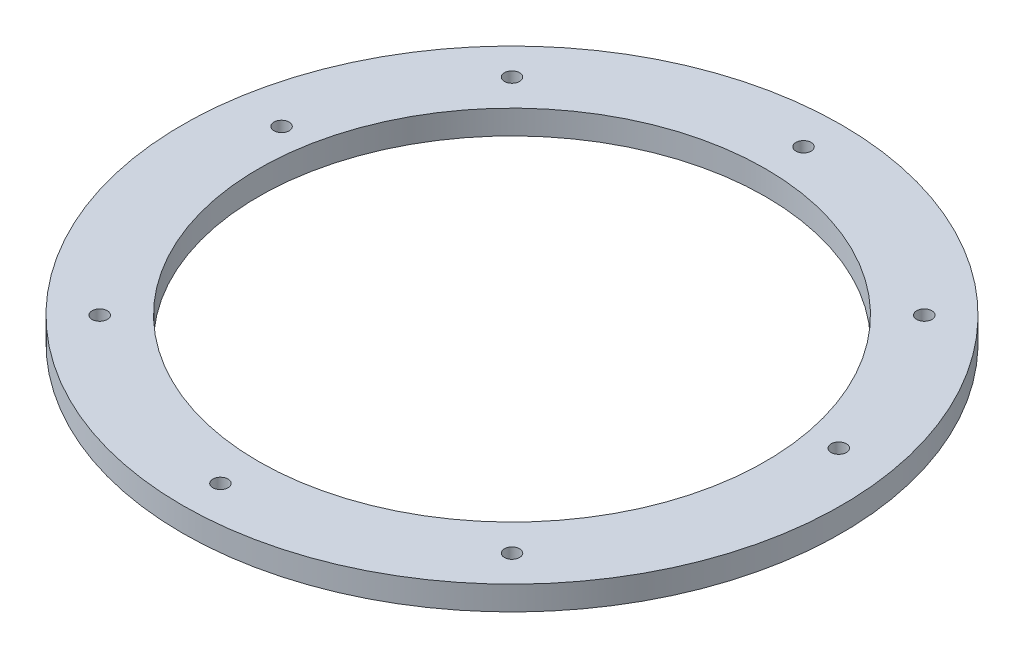
ISO-10303-21;
HEADER;
FILE_DESCRIPTION(('STEP AP214'),'2;1');
FILE_NAME('part.step','',(''),(''),'','','');
FILE_SCHEMA(('AUTOMOTIVE_DESIGN { 1 0 10303 214 1 1 1 1 }'));
ENDSEC;
DATA;
#1=APPLICATION_CONTEXT('core data for automotive mechanical design processes');
#2=APPLICATION_PROTOCOL_DEFINITION('international standard','automotive_design',2000,#1);
#3=PRODUCT_CONTEXT('',#1,'mechanical');
#4=PRODUCT('Part','Part','',(#3));
#5=PRODUCT_RELATED_PRODUCT_CATEGORY('part','',(#4));
#6=PRODUCT_DEFINITION_FORMATION('','',#4);
#7=PRODUCT_DEFINITION_CONTEXT('part definition',#1,'design');
#8=PRODUCT_DEFINITION('design','',#6,#7);
#9=PRODUCT_DEFINITION_SHAPE('','',#8);
#10=(LENGTH_UNIT() NAMED_UNIT(*) SI_UNIT(.MILLI.,.METRE.));
#11=(NAMED_UNIT(*) PLANE_ANGLE_UNIT() SI_UNIT($,.RADIAN.));
#12=(NAMED_UNIT(*) SI_UNIT($,.STERADIAN.) SOLID_ANGLE_UNIT());
#13=UNCERTAINTY_MEASURE_WITH_UNIT(LENGTH_MEASURE(1.E-05),#10,'distance_accuracy_value','');
#14=(GEOMETRIC_REPRESENTATION_CONTEXT(3) GLOBAL_UNCERTAINTY_ASSIGNED_CONTEXT((#13)) GLOBAL_UNIT_ASSIGNED_CONTEXT((#10,
#11,#12)) REPRESENTATION_CONTEXT('',''));
#15=CARTESIAN_POINT('',(0.,0.,0.));
#16=DIRECTION('',(0.,0.,1.));
#17=DIRECTION('',(1.,0.,0.));
#18=AXIS2_PLACEMENT_3D('',#15,#16,#17);
#19=CARTESIAN_POINT('',(0.,4.75,0.));
#20=DIRECTION('',(0.,1.,0.));
#21=DIRECTION('',(0.,0.,1.));
#22=AXIS2_PLACEMENT_3D('',#19,#20,#21);
#23=PLANE('',#22);
#24=CARTESIAN_POINT('',(54.9519052838329,4.75,-9.49999999999948));
#25=DIRECTION('',(0.,1.,0.));
#26=DIRECTION('',(0.,0.,1.));
#27=AXIS2_PLACEMENT_3D('',#24,#25,#26);
#28=CIRCLE('',#27,1.5);
#29=CARTESIAN_POINT('',(54.9519052838329,4.75,-7.99999999999948));
#30=VERTEX_POINT('',#29);
#31=EDGE_CURVE('E108',#30,#30,#28,.T.);
#32=ORIENTED_EDGE('',*,*,#31,.F.);
#33=EDGE_LOOP('',(#32));
#34=FACE_BOUND('',#33,.T.);
#35=CARTESIAN_POINT('',(-54.9519052838329,4.75,-9.49999999999948));
#36=DIRECTION('',(0.,1.,0.));
#37=DIRECTION('',(0.,0.,-1.));
#38=AXIS2_PLACEMENT_3D('',#35,#36,#37);
#39=CIRCLE('',#38,1.5);
#40=CARTESIAN_POINT('',(-54.9519052838329,4.75,-10.9999999999995));
#41=VERTEX_POINT('',#40);
#42=EDGE_CURVE('E105',#41,#41,#39,.T.);
#43=ORIENTED_EDGE('',*,*,#42,.F.);
#44=EDGE_LOOP('',(#43));
#45=FACE_BOUND('',#44,.T.);
#46=CARTESIAN_POINT('',(0.,4.75,-57.5));
#47=DIRECTION('',(0.,-1.,0.));
#48=DIRECTION('',(0.,0.,-1.));
#49=AXIS2_PLACEMENT_3D('',#46,#47,#48);
#50=CIRCLE('',#49,1.5);
#51=CARTESIAN_POINT('',(0.,4.75,-59.));
#52=VERTEX_POINT('',#51);
#53=EDGE_CURVE('E90',#52,#52,#50,.T.);
#54=ORIENTED_EDGE('',*,*,#53,.T.);
#55=EDGE_LOOP('',(#54));
#56=FACE_BOUND('',#55,.T.);
#57=CARTESIAN_POINT('',(0.,4.75,57.5));
#58=DIRECTION('',(0.,1.,0.));
#59=DIRECTION('',(0.,0.,1.));
#60=AXIS2_PLACEMENT_3D('',#57,#58,#59);
#61=CIRCLE('',#60,1.5);
#62=CARTESIAN_POINT('',(0.,4.75,59.));
#63=VERTEX_POINT('',#62);
#64=EDGE_CURVE('E87',#63,#63,#61,.T.);
#65=ORIENTED_EDGE('',*,*,#64,.F.);
#66=EDGE_LOOP('',(#65));
#67=FACE_BOUND('',#66,.T.);
#68=CARTESIAN_POINT('',(40.6586399182265,4.75,40.6586399182265));
#69=DIRECTION('',(0.,1.,0.));
#70=DIRECTION('',(0.,0.,1.));
#71=AXIS2_PLACEMENT_3D('',#68,#69,#70);
#72=CIRCLE('',#71,1.5);
#73=CARTESIAN_POINT('',(40.6586399182265,4.75,42.1586399182265));
#74=VERTEX_POINT('',#73);
#75=EDGE_CURVE('E86',#74,#74,#72,.T.);
#76=ORIENTED_EDGE('',*,*,#75,.F.);
#77=EDGE_LOOP('',(#76));
#78=FACE_BOUND('',#77,.T.);
#79=CARTESIAN_POINT('',(0.,4.75,0.));
#80=DIRECTION('',(0.,1.,0.));
#81=DIRECTION('',(0.,0.,1.));
#82=AXIS2_PLACEMENT_3D('',#79,#80,#81);
#83=CIRCLE('',#82,50.);
#84=CARTESIAN_POINT('',(0.,4.75,50.));
#85=VERTEX_POINT('',#84);
#86=EDGE_CURVE('E52',#85,#85,#83,.T.);
#87=ORIENTED_EDGE('',*,*,#86,.F.);
#88=EDGE_LOOP('',(#87));
#89=FACE_BOUND('',#88,.T.);
#90=CARTESIAN_POINT('',(0.,4.75,0.));
#91=DIRECTION('',(0.,1.,0.));
#92=DIRECTION('',(0.,0.,1.));
#93=AXIS2_PLACEMENT_3D('',#90,#91,#92);
#94=CIRCLE('',#93,65.);
#95=CARTESIAN_POINT('',(0.,4.75,65.));
#96=VERTEX_POINT('',#95);
#97=EDGE_CURVE('E10',#96,#96,#94,.T.);
#98=ORIENTED_EDGE('',*,*,#97,.T.);
#99=EDGE_LOOP('',(#98));
#100=FACE_BOUND('',#99,.T.);
#101=CARTESIAN_POINT('',(40.6586399182264,4.75,-40.6586399182265));
#102=DIRECTION('',(0.,1.,0.));
#103=DIRECTION('',(0.,0.,1.));
#104=AXIS2_PLACEMENT_3D('',#101,#102,#103);
#105=CIRCLE('',#104,1.5);
#106=CARTESIAN_POINT('',(40.6586399182264,4.75,-39.1586399182265));
#107=VERTEX_POINT('',#106);
#108=EDGE_CURVE('E62',#107,#107,#105,.T.);
#109=ORIENTED_EDGE('',*,*,#108,.F.);
#110=EDGE_LOOP('',(#109));
#111=FACE_BOUND('',#110,.T.);
#112=CARTESIAN_POINT('',(-40.6586399182265,4.75,-40.6586399182264));
#113=DIRECTION('',(0.,-1.,0.));
#114=DIRECTION('',(0.,0.,-1.));
#115=AXIS2_PLACEMENT_3D('',#112,#113,#114);
#116=CIRCLE('',#115,1.5);
#117=CARTESIAN_POINT('',(-40.6586399182265,4.75,-42.1586399182264));
#118=VERTEX_POINT('',#117);
#119=EDGE_CURVE('E96',#118,#118,#116,.T.);
#120=ORIENTED_EDGE('',*,*,#119,.T.);
#121=EDGE_LOOP('',(#120));
#122=FACE_BOUND('',#121,.T.);
#123=CARTESIAN_POINT('',(-40.6586399182265,4.75,40.6586399182264));
#124=DIRECTION('',(0.,-1.,0.));
#125=DIRECTION('',(0.,0.,-1.));
#126=AXIS2_PLACEMENT_3D('',#123,#124,#125);
#127=CIRCLE('',#126,1.5);
#128=CARTESIAN_POINT('',(-40.6586399182265,4.75,39.1586399182264));
#129=VERTEX_POINT('',#128);
#130=EDGE_CURVE('E93',#129,#129,#127,.T.);
#131=ORIENTED_EDGE('',*,*,#130,.T.);
#132=EDGE_LOOP('',(#131));
#133=FACE_BOUND('',#132,.T.);
#134=ADVANCED_FACE('F39',(#34,#45,#56,#67,#78,#89,#100,#111,#122,#133),#23,.T.);
#135=CARTESIAN_POINT('',(0.,0.,0.));
#136=DIRECTION('',(0.,1.,0.));
#137=DIRECTION('',(0.,0.,1.));
#138=AXIS2_PLACEMENT_3D('',#135,#136,#137);
#139=PLANE('',#138);
#140=CARTESIAN_POINT('',(54.9519052838329,0.,-9.49999999999948));
#141=DIRECTION('',(0.,1.,0.));
#142=DIRECTION('',(0.,0.,1.));
#143=AXIS2_PLACEMENT_3D('',#140,#141,#142);
#144=CIRCLE('',#143,1.5);
#145=CARTESIAN_POINT('',(54.9519052838329,0.,-7.99999999999948));
#146=VERTEX_POINT('',#145);
#147=EDGE_CURVE('E101',#146,#146,#144,.T.);
#148=ORIENTED_EDGE('',*,*,#147,.T.);
#149=EDGE_LOOP('',(#148));
#150=FACE_BOUND('',#149,.T.);
#151=CARTESIAN_POINT('',(-54.9519052838329,0.,-9.49999999999948));
#152=DIRECTION('',(0.,1.,0.));
#153=DIRECTION('',(0.,0.,-1.));
#154=AXIS2_PLACEMENT_3D('',#151,#152,#153);
#155=CIRCLE('',#154,1.5);
#156=CARTESIAN_POINT('',(-54.9519052838329,0.,-10.9999999999995));
#157=VERTEX_POINT('',#156);
#158=EDGE_CURVE('E102',#157,#157,#155,.T.);
#159=ORIENTED_EDGE('',*,*,#158,.T.);
#160=EDGE_LOOP('',(#159));
#161=FACE_BOUND('',#160,.T.);
#162=CARTESIAN_POINT('',(0.,0.,57.5));
#163=DIRECTION('',(0.,1.,0.));
#164=DIRECTION('',(0.,0.,1.));
#165=AXIS2_PLACEMENT_3D('',#162,#163,#164);
#166=CIRCLE('',#165,1.5);
#167=CARTESIAN_POINT('',(0.,0.,59.));
#168=VERTEX_POINT('',#167);
#169=EDGE_CURVE('E68',#168,#168,#166,.T.);
#170=ORIENTED_EDGE('',*,*,#169,.T.);
#171=EDGE_LOOP('',(#170));
#172=FACE_BOUND('',#171,.T.);
#173=CARTESIAN_POINT('',(40.6586399182265,0.,40.6586399182265));
#174=DIRECTION('',(0.,1.,0.));
#175=DIRECTION('',(0.,0.,1.));
#176=AXIS2_PLACEMENT_3D('',#173,#174,#175);
#177=CIRCLE('',#176,1.5);
#178=CARTESIAN_POINT('',(40.6586399182265,0.,42.1586399182265));
#179=VERTEX_POINT('',#178);
#180=EDGE_CURVE('E65',#179,#179,#177,.T.);
#181=ORIENTED_EDGE('',*,*,#180,.T.);
#182=EDGE_LOOP('',(#181));
#183=FACE_BOUND('',#182,.T.);
#184=CARTESIAN_POINT('',(40.6586399182264,0.,-40.6586399182265));
#185=DIRECTION('',(0.,1.,0.));
#186=DIRECTION('',(0.,0.,1.));
#187=AXIS2_PLACEMENT_3D('',#184,#185,#186);
#188=CIRCLE('',#187,1.5);
#189=CARTESIAN_POINT('',(40.6586399182264,0.,-39.1586399182265));
#190=VERTEX_POINT('',#189);
#191=EDGE_CURVE('E58',#190,#190,#188,.T.);
#192=ORIENTED_EDGE('',*,*,#191,.T.);
#193=EDGE_LOOP('',(#192));
#194=FACE_BOUND('',#193,.T.);
#195=CARTESIAN_POINT('',(0.,0.,0.));
#196=DIRECTION('',(0.,1.,0.));
#197=DIRECTION('',(0.,0.,1.));
#198=AXIS2_PLACEMENT_3D('',#195,#196,#197);
#199=CIRCLE('',#198,65.);
#200=CARTESIAN_POINT('',(0.,0.,65.));
#201=VERTEX_POINT('',#200);
#202=EDGE_CURVE('E47',#201,#201,#199,.T.);
#203=ORIENTED_EDGE('',*,*,#202,.F.);
#204=EDGE_LOOP('',(#203));
#205=FACE_BOUND('',#204,.T.);
#206=CARTESIAN_POINT('',(0.,0.,0.));
#207=DIRECTION('',(0.,1.,0.));
#208=DIRECTION('',(0.,0.,1.));
#209=AXIS2_PLACEMENT_3D('',#206,#207,#208);
#210=CIRCLE('',#209,50.);
#211=CARTESIAN_POINT('',(0.,0.,50.));
#212=VERTEX_POINT('',#211);
#213=EDGE_CURVE('E55',#212,#212,#210,.T.);
#214=ORIENTED_EDGE('',*,*,#213,.T.);
#215=EDGE_LOOP('',(#214));
#216=FACE_BOUND('',#215,.T.);
#217=CARTESIAN_POINT('',(-40.6586399182265,0.,-40.6586399182264));
#218=DIRECTION('',(0.,1.,0.));
#219=DIRECTION('',(0.,0.,1.));
#220=AXIS2_PLACEMENT_3D('',#217,#218,#219);
#221=CIRCLE('',#220,1.5);
#222=CARTESIAN_POINT('',(-40.6586399182265,0.,-39.1586399182264));
#223=VERTEX_POINT('',#222);
#224=EDGE_CURVE('E61',#223,#223,#221,.F.);
#225=ORIENTED_EDGE('',*,*,#224,.F.);
#226=EDGE_LOOP('',(#225));
#227=FACE_BOUND('',#226,.T.);
#228=CARTESIAN_POINT('',(0.,0.,-57.5));
#229=DIRECTION('',(0.,1.,0.));
#230=DIRECTION('',(0.,0.,1.));
#231=AXIS2_PLACEMENT_3D('',#228,#229,#230);
#232=CIRCLE('',#231,1.5);
#233=CARTESIAN_POINT('',(0.,0.,-56.));
#234=VERTEX_POINT('',#233);
#235=EDGE_CURVE('E70',#234,#234,#232,.F.);
#236=ORIENTED_EDGE('',*,*,#235,.F.);
#237=EDGE_LOOP('',(#236));
#238=FACE_BOUND('',#237,.T.);
#239=CARTESIAN_POINT('',(-40.6586399182265,0.,40.6586399182264));
#240=DIRECTION('',(0.,1.,0.));
#241=DIRECTION('',(0.,0.,1.));
#242=AXIS2_PLACEMENT_3D('',#239,#240,#241);
#243=CIRCLE('',#242,1.5);
#244=CARTESIAN_POINT('',(-40.6586399182265,0.,42.1586399182264));
#245=VERTEX_POINT('',#244);
#246=EDGE_CURVE('E43',#245,#245,#243,.F.);
#247=ORIENTED_EDGE('',*,*,#246,.F.);
#248=EDGE_LOOP('',(#247));
#249=FACE_BOUND('',#248,.T.);
#250=ADVANCED_FACE('F114',(#150,#161,#172,#183,#194,#205,#216,#227,#238,#249),#139,.F.);
#251=CARTESIAN_POINT('',(0.,4.75,0.));
#252=DIRECTION('',(0.,-1.,0.));
#253=DIRECTION('',(0.,0.,-1.));
#254=AXIS2_PLACEMENT_3D('',#251,#252,#253);
#255=CYLINDRICAL_SURFACE('',#254,65.);
#256=ORIENTED_EDGE('',*,*,#97,.F.);
#257=EDGE_LOOP('',(#256));
#258=FACE_BOUND('',#257,.T.);
#259=ORIENTED_EDGE('',*,*,#202,.T.);
#260=EDGE_LOOP('',(#259));
#261=FACE_BOUND('',#260,.T.);
#262=ADVANCED_FACE('F41',(#258,#261),#255,.T.);
#263=CARTESIAN_POINT('',(0.,4.75,0.));
#264=DIRECTION('',(0.,-1.,0.));
#265=DIRECTION('',(0.,0.,-1.));
#266=AXIS2_PLACEMENT_3D('',#263,#264,#265);
#267=CYLINDRICAL_SURFACE('',#266,50.);
#268=ORIENTED_EDGE('',*,*,#86,.T.);
#269=EDGE_LOOP('',(#268));
#270=FACE_BOUND('',#269,.T.);
#271=ORIENTED_EDGE('',*,*,#213,.F.);
#272=EDGE_LOOP('',(#271));
#273=FACE_BOUND('',#272,.T.);
#274=ADVANCED_FACE('F168',(#270,#273),#267,.F.);
#275=CARTESIAN_POINT('',(40.6586399182264,-0.25,-40.6586399182265));
#276=DIRECTION('',(0.,1.,0.));
#277=DIRECTION('',(0.,0.,1.));
#278=AXIS2_PLACEMENT_3D('',#275,#276,#277);
#279=CYLINDRICAL_SURFACE('',#278,1.5);
#280=ORIENTED_EDGE('',*,*,#108,.T.);
#281=EDGE_LOOP('',(#280));
#282=FACE_BOUND('',#281,.T.);
#283=ORIENTED_EDGE('',*,*,#191,.F.);
#284=EDGE_LOOP('',(#283));
#285=FACE_BOUND('',#284,.T.);
#286=ADVANCED_FACE('F165',(#282,#285),#279,.F.);
#287=CARTESIAN_POINT('',(-40.6586399182265,-0.25,-40.6586399182264));
#288=DIRECTION('',(0.,1.,0.));
#289=DIRECTION('',(0.,0.,1.));
#290=AXIS2_PLACEMENT_3D('',#287,#288,#289);
#291=CYLINDRICAL_SURFACE('',#290,1.5);
#292=ORIENTED_EDGE('',*,*,#119,.F.);
#293=EDGE_LOOP('',(#292));
#294=FACE_BOUND('',#293,.T.);
#295=ORIENTED_EDGE('',*,*,#224,.T.);
#296=EDGE_LOOP('',(#295));
#297=FACE_BOUND('',#296,.T.);
#298=ADVANCED_FACE('F160',(#294,#297),#291,.F.);
#299=CARTESIAN_POINT('',(40.6586399182265,-0.25,40.6586399182265));
#300=DIRECTION('',(0.,1.,0.));
#301=DIRECTION('',(0.,0.,1.));
#302=AXIS2_PLACEMENT_3D('',#299,#300,#301);
#303=CYLINDRICAL_SURFACE('',#302,1.5);
#304=ORIENTED_EDGE('',*,*,#75,.T.);
#305=EDGE_LOOP('',(#304));
#306=FACE_BOUND('',#305,.T.);
#307=ORIENTED_EDGE('',*,*,#180,.F.);
#308=EDGE_LOOP('',(#307));
#309=FACE_BOUND('',#308,.T.);
#310=ADVANCED_FACE('F157',(#306,#309),#303,.F.);
#311=CARTESIAN_POINT('',(0.,-0.25,57.5));
#312=DIRECTION('',(0.,1.,0.));
#313=DIRECTION('',(0.,0.,1.));
#314=AXIS2_PLACEMENT_3D('',#311,#312,#313);
#315=CYLINDRICAL_SURFACE('',#314,1.5);
#316=ORIENTED_EDGE('',*,*,#64,.T.);
#317=EDGE_LOOP('',(#316));
#318=FACE_BOUND('',#317,.T.);
#319=ORIENTED_EDGE('',*,*,#169,.F.);
#320=EDGE_LOOP('',(#319));
#321=FACE_BOUND('',#320,.T.);
#322=ADVANCED_FACE('F152',(#318,#321),#315,.F.);
#323=CARTESIAN_POINT('',(0.,-0.25,-57.5));
#324=DIRECTION('',(0.,1.,0.));
#325=DIRECTION('',(0.,0.,1.));
#326=AXIS2_PLACEMENT_3D('',#323,#324,#325);
#327=CYLINDRICAL_SURFACE('',#326,1.5);
#328=ORIENTED_EDGE('',*,*,#53,.F.);
#329=EDGE_LOOP('',(#328));
#330=FACE_BOUND('',#329,.T.);
#331=ORIENTED_EDGE('',*,*,#235,.T.);
#332=EDGE_LOOP('',(#331));
#333=FACE_BOUND('',#332,.T.);
#334=ADVANCED_FACE('F144',(#330,#333),#327,.F.);
#335=CARTESIAN_POINT('',(-40.6586399182265,-0.25,40.6586399182264));
#336=DIRECTION('',(0.,1.,0.));
#337=DIRECTION('',(0.,0.,1.));
#338=AXIS2_PLACEMENT_3D('',#335,#336,#337);
#339=CYLINDRICAL_SURFACE('',#338,1.5);
#340=ORIENTED_EDGE('',*,*,#130,.F.);
#341=EDGE_LOOP('',(#340));
#342=FACE_BOUND('',#341,.T.);
#343=ORIENTED_EDGE('',*,*,#246,.T.);
#344=EDGE_LOOP('',(#343));
#345=FACE_BOUND('',#344,.T.);
#346=ADVANCED_FACE('F142',(#342,#345),#339,.F.);
#347=CARTESIAN_POINT('',(-54.9519052838329,0.,-9.49999999999948));
#348=DIRECTION('',(0.,1.,0.));
#349=DIRECTION('',(0.,0.,1.));
#350=AXIS2_PLACEMENT_3D('',#347,#348,#349);
#351=CYLINDRICAL_SURFACE('',#350,1.5);
#352=ORIENTED_EDGE('',*,*,#158,.F.);
#353=EDGE_LOOP('',(#352));
#354=FACE_BOUND('',#353,.T.);
#355=ORIENTED_EDGE('',*,*,#42,.T.);
#356=EDGE_LOOP('',(#355));
#357=FACE_BOUND('',#356,.T.);
#358=ADVANCED_FACE('F120',(#354,#357),#351,.F.);
#359=CARTESIAN_POINT('',(54.9519052838329,0.,-9.49999999999948));
#360=DIRECTION('',(0.,1.,0.));
#361=DIRECTION('',(0.,0.,1.));
#362=AXIS2_PLACEMENT_3D('',#359,#360,#361);
#363=CYLINDRICAL_SURFACE('',#362,1.5);
#364=ORIENTED_EDGE('',*,*,#147,.F.);
#365=EDGE_LOOP('',(#364));
#366=FACE_BOUND('',#365,.T.);
#367=ORIENTED_EDGE('',*,*,#31,.T.);
#368=EDGE_LOOP('',(#367));
#369=FACE_BOUND('',#368,.T.);
#370=ADVANCED_FACE('F117',(#366,#369),#363,.F.);
#371=CLOSED_SHELL('',(#134,#250,#262,#274,#286,#298,#310,#322,#334,#346,#358,#370));
#372=MANIFOLD_SOLID_BREP('B2',#371);
#373=ADVANCED_BREP_SHAPE_REPRESENTATION('',(#18,#372),#14);
#374=SHAPE_DEFINITION_REPRESENTATION(#9,#373);
ENDSEC;
END-ISO-10303-21;
